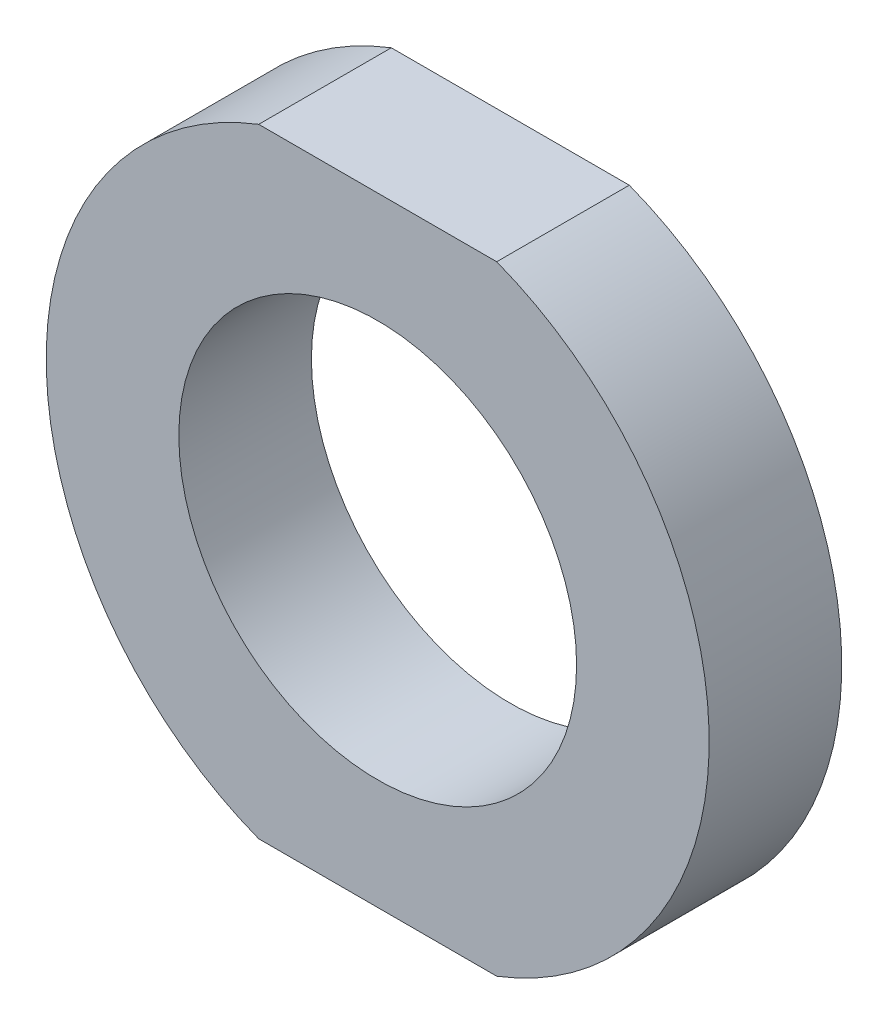
ISO-10303-21;
HEADER;
FILE_DESCRIPTION(('STEP AP214'),'2;1');
FILE_NAME('part.step','',(''),(''),'','','');
FILE_SCHEMA(('AUTOMOTIVE_DESIGN { 1 0 10303 214 1 1 1 1 }'));
ENDSEC;
DATA;
#1=APPLICATION_CONTEXT('core data for automotive mechanical design processes');
#2=APPLICATION_PROTOCOL_DEFINITION('international standard','automotive_design',2000,#1);
#3=PRODUCT_CONTEXT('',#1,'mechanical');
#4=PRODUCT('Part','Part','',(#3));
#5=PRODUCT_RELATED_PRODUCT_CATEGORY('part','',(#4));
#6=PRODUCT_DEFINITION_FORMATION('','',#4);
#7=PRODUCT_DEFINITION_CONTEXT('part definition',#1,'design');
#8=PRODUCT_DEFINITION('design','',#6,#7);
#9=PRODUCT_DEFINITION_SHAPE('','',#8);
#10=(LENGTH_UNIT() NAMED_UNIT(*) SI_UNIT(.MILLI.,.METRE.));
#11=(NAMED_UNIT(*) PLANE_ANGLE_UNIT() SI_UNIT($,.RADIAN.));
#12=(NAMED_UNIT(*) SI_UNIT($,.STERADIAN.) SOLID_ANGLE_UNIT());
#13=UNCERTAINTY_MEASURE_WITH_UNIT(LENGTH_MEASURE(1.E-05),#10,'distance_accuracy_value','');
#14=(GEOMETRIC_REPRESENTATION_CONTEXT(3) GLOBAL_UNCERTAINTY_ASSIGNED_CONTEXT((#13)) GLOBAL_UNIT_ASSIGNED_CONTEXT((#10,
#11,#12)) REPRESENTATION_CONTEXT('',''));
#15=CARTESIAN_POINT('',(0.,0.,0.));
#16=DIRECTION('',(0.,0.,1.));
#17=DIRECTION('',(1.,0.,0.));
#18=AXIS2_PLACEMENT_3D('',#15,#16,#17);
#19=CARTESIAN_POINT('',(0.,0.,3.));
#20=DIRECTION('',(0.,0.,1.));
#21=DIRECTION('',(1.,0.,0.));
#22=AXIS2_PLACEMENT_3D('',#19,#20,#21);
#23=PLANE('',#22);
#24=CARTESIAN_POINT('',(0.,0.,3.));
#25=DIRECTION('',(0.,0.,1.));
#26=DIRECTION('',(1.,0.,0.));
#27=AXIS2_PLACEMENT_3D('',#24,#25,#26);
#28=CIRCLE('',#27,7.5);
#29=CARTESIAN_POINT('',(-2.69258240356725,7.,3.));
#30=VERTEX_POINT('',#29);
#31=CARTESIAN_POINT('',(-2.69258240356725,-7.,3.));
#32=VERTEX_POINT('',#31);
#33=EDGE_CURVE('E88',#30,#32,#28,.T.);
#34=ORIENTED_EDGE('',*,*,#33,.T.);
#35=DIRECTION('',(1.,0.,0.));
#36=VECTOR('',#35,1.);
#37=CARTESIAN_POINT('',(-2.69258240356725,-7.,3.));
#38=LINE('',#37,#36);
#39=CARTESIAN_POINT('',(2.69258240356725,-7.,3.));
#40=VERTEX_POINT('',#39);
#41=EDGE_CURVE('E83',#32,#40,#38,.T.);
#42=ORIENTED_EDGE('',*,*,#41,.T.);
#43=CARTESIAN_POINT('',(0.,0.,3.));
#44=DIRECTION('',(0.,0.,1.));
#45=DIRECTION('',(1.,0.,0.));
#46=AXIS2_PLACEMENT_3D('',#43,#44,#45);
#47=CIRCLE('',#46,7.5);
#48=CARTESIAN_POINT('',(2.69258240356725,7.,3.));
#49=VERTEX_POINT('',#48);
#50=EDGE_CURVE('E86',#40,#49,#47,.T.);
#51=ORIENTED_EDGE('',*,*,#50,.T.);
#52=DIRECTION('',(-1.,0.,0.));
#53=VECTOR('',#52,1.);
#54=CARTESIAN_POINT('',(-2.69258240356725,7.,3.));
#55=LINE('',#54,#53);
#56=EDGE_CURVE('E53',#49,#30,#55,.T.);
#57=ORIENTED_EDGE('',*,*,#56,.T.);
#58=EDGE_LOOP('',(#34,#42,#51,#57));
#59=FACE_BOUND('',#58,.T.);
#60=CARTESIAN_POINT('',(0.,0.,3.));
#61=DIRECTION('',(0.,0.,1.));
#62=DIRECTION('',(1.,0.,0.));
#63=AXIS2_PLACEMENT_3D('',#60,#61,#62);
#64=CIRCLE('',#63,4.5);
#65=CARTESIAN_POINT('',(4.5,0.,3.));
#66=VERTEX_POINT('',#65);
#67=EDGE_CURVE('E103',#66,#66,#64,.T.);
#68=ORIENTED_EDGE('',*,*,#67,.F.);
#69=EDGE_LOOP('',(#68));
#70=FACE_BOUND('',#69,.T.);
#71=ADVANCED_FACE('F36',(#59,#70),#23,.T.);
#72=CARTESIAN_POINT('',(0.,0.,0.));
#73=DIRECTION('',(0.,0.,1.));
#74=DIRECTION('',(1.,0.,0.));
#75=AXIS2_PLACEMENT_3D('',#72,#73,#74);
#76=PLANE('',#75);
#77=CARTESIAN_POINT('',(0.,0.,0.));
#78=DIRECTION('',(0.,0.,1.));
#79=DIRECTION('',(1.,0.,0.));
#80=AXIS2_PLACEMENT_3D('',#77,#78,#79);
#81=CIRCLE('',#80,7.5);
#82=CARTESIAN_POINT('',(-2.69258240356725,7.,0.));
#83=VERTEX_POINT('',#82);
#84=CARTESIAN_POINT('',(-2.69258240356725,-7.,0.));
#85=VERTEX_POINT('',#84);
#86=EDGE_CURVE('E100',#83,#85,#81,.T.);
#87=ORIENTED_EDGE('',*,*,#86,.F.);
#88=DIRECTION('',(-1.,0.,0.));
#89=VECTOR('',#88,1.);
#90=CARTESIAN_POINT('',(-2.69258240356725,7.,0.));
#91=LINE('',#90,#89);
#92=CARTESIAN_POINT('',(2.69258240356725,7.,0.));
#93=VERTEX_POINT('',#92);
#94=EDGE_CURVE('E76',#93,#83,#91,.T.);
#95=ORIENTED_EDGE('',*,*,#94,.F.);
#96=CARTESIAN_POINT('',(0.,0.,0.));
#97=DIRECTION('',(0.,0.,1.));
#98=DIRECTION('',(1.,0.,0.));
#99=AXIS2_PLACEMENT_3D('',#96,#97,#98);
#100=CIRCLE('',#99,7.5);
#101=CARTESIAN_POINT('',(2.69258240356725,-7.,0.));
#102=VERTEX_POINT('',#101);
#103=EDGE_CURVE('E70',#102,#93,#100,.T.);
#104=ORIENTED_EDGE('',*,*,#103,.F.);
#105=DIRECTION('',(1.,0.,0.));
#106=VECTOR('',#105,1.);
#107=CARTESIAN_POINT('',(-2.69258240356725,-7.,0.));
#108=LINE('',#107,#106);
#109=EDGE_CURVE('E92',#85,#102,#108,.T.);
#110=ORIENTED_EDGE('',*,*,#109,.F.);
#111=EDGE_LOOP('',(#87,#95,#104,#110));
#112=FACE_BOUND('',#111,.T.);
#113=CARTESIAN_POINT('',(0.,0.,0.));
#114=DIRECTION('',(0.,0.,1.));
#115=DIRECTION('',(1.,0.,0.));
#116=AXIS2_PLACEMENT_3D('',#113,#114,#115);
#117=CIRCLE('',#116,4.5);
#118=CARTESIAN_POINT('',(4.5,0.,0.));
#119=VERTEX_POINT('',#118);
#120=EDGE_CURVE('E115',#119,#119,#117,.T.);
#121=ORIENTED_EDGE('',*,*,#120,.T.);
#122=EDGE_LOOP('',(#121));
#123=FACE_BOUND('',#122,.T.);
#124=ADVANCED_FACE('F111',(#112,#123),#76,.F.);
#125=CARTESIAN_POINT('',(0.,0.,3.));
#126=DIRECTION('',(0.,0.,-1.));
#127=DIRECTION('',(-1.,0.,0.));
#128=AXIS2_PLACEMENT_3D('',#125,#126,#127);
#129=CYLINDRICAL_SURFACE('',#128,7.5);
#130=ORIENTED_EDGE('',*,*,#86,.T.);
#131=DIRECTION('',(0.,0.,-1.));
#132=VECTOR('',#131,1.);
#133=CARTESIAN_POINT('',(-2.69258240356725,-7.,3.));
#134=LINE('',#133,#132);
#135=EDGE_CURVE('E11',#32,#85,#134,.T.);
#136=ORIENTED_EDGE('',*,*,#135,.F.);
#137=ORIENTED_EDGE('',*,*,#33,.F.);
#138=DIRECTION('',(0.,0.,-1.));
#139=VECTOR('',#138,1.);
#140=CARTESIAN_POINT('',(-2.69258240356725,7.,3.));
#141=LINE('',#140,#139);
#142=EDGE_CURVE('E96',#30,#83,#141,.T.);
#143=ORIENTED_EDGE('',*,*,#142,.T.);
#144=EDGE_LOOP('',(#130,#136,#137,#143));
#145=FACE_BOUND('',#144,.T.);
#146=ADVANCED_FACE('F38',(#145),#129,.T.);
#147=CARTESIAN_POINT('',(-2.69258240356725,-7.,3.));
#148=DIRECTION('',(0.,1.,0.));
#149=DIRECTION('',(0.,0.,1.));
#150=AXIS2_PLACEMENT_3D('',#147,#148,#149);
#151=PLANE('',#150);
#152=ORIENTED_EDGE('',*,*,#109,.T.);
#153=DIRECTION('',(0.,0.,-1.));
#154=VECTOR('',#153,1.);
#155=CARTESIAN_POINT('',(2.69258240356725,-7.,3.));
#156=LINE('',#155,#154);
#157=EDGE_CURVE('E45',#40,#102,#156,.T.);
#158=ORIENTED_EDGE('',*,*,#157,.F.);
#159=ORIENTED_EDGE('',*,*,#41,.F.);
#160=ORIENTED_EDGE('',*,*,#135,.T.);
#161=EDGE_LOOP('',(#152,#158,#159,#160));
#162=FACE_BOUND('',#161,.T.);
#163=ADVANCED_FACE('F91',(#162),#151,.F.);
#164=CARTESIAN_POINT('',(0.,0.,3.));
#165=DIRECTION('',(0.,0.,-1.));
#166=DIRECTION('',(-1.,0.,0.));
#167=AXIS2_PLACEMENT_3D('',#164,#165,#166);
#168=CYLINDRICAL_SURFACE('',#167,7.5);
#169=ORIENTED_EDGE('',*,*,#103,.T.);
#170=DIRECTION('',(0.,0.,-1.));
#171=VECTOR('',#170,1.);
#172=CARTESIAN_POINT('',(2.69258240356725,7.,3.));
#173=LINE('',#172,#171);
#174=EDGE_CURVE('E93',#49,#93,#173,.T.);
#175=ORIENTED_EDGE('',*,*,#174,.F.);
#176=ORIENTED_EDGE('',*,*,#50,.F.);
#177=ORIENTED_EDGE('',*,*,#157,.T.);
#178=EDGE_LOOP('',(#169,#175,#176,#177));
#179=FACE_BOUND('',#178,.T.);
#180=ADVANCED_FACE('F94',(#179),#168,.T.);
#181=CARTESIAN_POINT('',(-2.69258240356725,7.,3.));
#182=DIRECTION('',(0.,-1.,0.));
#183=DIRECTION('',(0.,0.,-1.));
#184=AXIS2_PLACEMENT_3D('',#181,#182,#183);
#185=PLANE('',#184);
#186=ORIENTED_EDGE('',*,*,#94,.T.);
#187=ORIENTED_EDGE('',*,*,#142,.F.);
#188=ORIENTED_EDGE('',*,*,#56,.F.);
#189=ORIENTED_EDGE('',*,*,#174,.T.);
#190=EDGE_LOOP('',(#186,#187,#188,#189));
#191=FACE_BOUND('',#190,.T.);
#192=ADVANCED_FACE('F108',(#191),#185,.F.);
#193=CARTESIAN_POINT('',(0.,0.,3.));
#194=DIRECTION('',(0.,0.,-1.));
#195=DIRECTION('',(-1.,0.,0.));
#196=AXIS2_PLACEMENT_3D('',#193,#194,#195);
#197=CYLINDRICAL_SURFACE('',#196,4.5);
#198=ORIENTED_EDGE('',*,*,#67,.T.);
#199=EDGE_LOOP('',(#198));
#200=FACE_BOUND('',#199,.T.);
#201=ORIENTED_EDGE('',*,*,#120,.F.);
#202=EDGE_LOOP('',(#201));
#203=FACE_BOUND('',#202,.T.);
#204=ADVANCED_FACE('F121',(#200,#203),#197,.F.);
#205=CLOSED_SHELL('',(#71,#124,#146,#163,#180,#192,#204));
#206=MANIFOLD_SOLID_BREP('B2',#205);
#207=ADVANCED_BREP_SHAPE_REPRESENTATION('',(#18,#206),#14);
#208=SHAPE_DEFINITION_REPRESENTATION(#9,#207);
ENDSEC;
END-ISO-10303-21;
